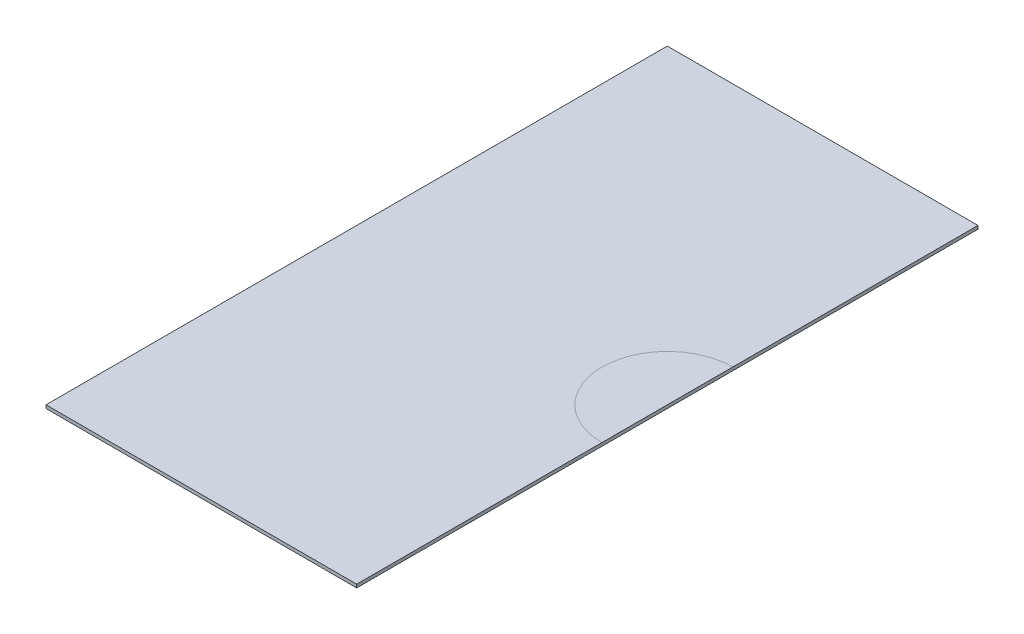
ISO-10303-21;
HEADER;
FILE_DESCRIPTION(('STEP AP214'),'2;1');
FILE_NAME('part.step','',(''),(''),'','','');
FILE_SCHEMA(('AUTOMOTIVE_DESIGN { 1 0 10303 214 1 1 1 1 }'));
ENDSEC;
DATA;
#1=APPLICATION_CONTEXT('core data for automotive mechanical design processes');
#2=APPLICATION_PROTOCOL_DEFINITION('international standard','automotive_design',2000,#1);
#3=PRODUCT_CONTEXT('',#1,'mechanical');
#4=PRODUCT('Part','Part','',(#3));
#5=PRODUCT_RELATED_PRODUCT_CATEGORY('part','',(#4));
#6=PRODUCT_DEFINITION_FORMATION('','',#4);
#7=PRODUCT_DEFINITION_CONTEXT('part definition',#1,'design');
#8=PRODUCT_DEFINITION('design','',#6,#7);
#9=PRODUCT_DEFINITION_SHAPE('','',#8);
#10=(LENGTH_UNIT() NAMED_UNIT(*) SI_UNIT(.MILLI.,.METRE.));
#11=(NAMED_UNIT(*) PLANE_ANGLE_UNIT() SI_UNIT($,.RADIAN.));
#12=(NAMED_UNIT(*) SI_UNIT($,.STERADIAN.) SOLID_ANGLE_UNIT());
#13=UNCERTAINTY_MEASURE_WITH_UNIT(LENGTH_MEASURE(1.E-05),#10,'distance_accuracy_value','');
#14=(GEOMETRIC_REPRESENTATION_CONTEXT(3) GLOBAL_UNCERTAINTY_ASSIGNED_CONTEXT((#13)) GLOBAL_UNIT_ASSIGNED_CONTEXT((#10,
#11,#12)) REPRESENTATION_CONTEXT('',''));
#15=CARTESIAN_POINT('',(0.,0.,0.));
#16=DIRECTION('',(0.,0.,1.));
#17=DIRECTION('',(1.,0.,0.));
#18=AXIS2_PLACEMENT_3D('',#15,#16,#17);
#19=CARTESIAN_POINT('',(0.,0.5,0.));
#20=DIRECTION('',(0.,-1.,0.));
#21=DIRECTION('',(0.,0.,-1.));
#22=AXIS2_PLACEMENT_3D('',#19,#20,#21);
#23=PLANE('',#22);
#24=CARTESIAN_POINT('',(47.499999996,0.5,0.));
#25=DIRECTION('',(0.,-1.,0.));
#26=DIRECTION('',(0.,0.,-1.));
#27=AXIS2_PLACEMENT_3D('',#24,#25,#26);
#28=CIRCLE('',#27,20.);
#29=CARTESIAN_POINT('',(47.499999996,0.5,-20.));
#30=VERTEX_POINT('',#29);
#31=CARTESIAN_POINT('',(47.499999996,0.5,20.));
#32=VERTEX_POINT('',#31);
#33=EDGE_CURVE('E11',#30,#32,#28,.F.);
#34=ORIENTED_EDGE('',*,*,#33,.F.);
#35=DIRECTION('',(0.,0.,-1.));
#36=VECTOR('',#35,1.);
#37=CARTESIAN_POINT('',(47.499999996,0.5,94.999999992));
#38=LINE('',#37,#36);
#39=CARTESIAN_POINT('',(47.499999996,0.5,-94.999999992));
#40=VERTEX_POINT('',#39);
#41=EDGE_CURVE('E82',#30,#40,#38,.T.);
#42=ORIENTED_EDGE('',*,*,#41,.T.);
#43=DIRECTION('',(-1.,0.,0.));
#44=VECTOR('',#43,1.);
#45=CARTESIAN_POINT('',(-47.499999996,0.5,-94.999999992));
#46=LINE('',#45,#44);
#47=CARTESIAN_POINT('',(-47.499999996,0.5,-94.999999992));
#48=VERTEX_POINT('',#47);
#49=EDGE_CURVE('E84',#40,#48,#46,.T.);
#50=ORIENTED_EDGE('',*,*,#49,.T.);
#51=DIRECTION('',(0.,0.,1.));
#52=VECTOR('',#51,1.);
#53=CARTESIAN_POINT('',(-47.499999996,0.5,94.999999992));
#54=LINE('',#53,#52);
#55=CARTESIAN_POINT('',(-47.499999996,0.5,94.999999992));
#56=VERTEX_POINT('',#55);
#57=EDGE_CURVE('E101',#48,#56,#54,.T.);
#58=ORIENTED_EDGE('',*,*,#57,.T.);
#59=DIRECTION('',(1.,0.,0.));
#60=VECTOR('',#59,1.);
#61=CARTESIAN_POINT('',(-47.499999996,0.5,94.999999992));
#62=LINE('',#61,#60);
#63=CARTESIAN_POINT('',(47.499999996,0.5,94.999999992));
#64=VERTEX_POINT('',#63);
#65=EDGE_CURVE('E117',#56,#64,#62,.T.);
#66=ORIENTED_EDGE('',*,*,#65,.T.);
#67=EDGE_CURVE('E92',#64,#32,#38,.T.);
#68=ORIENTED_EDGE('',*,*,#67,.T.);
#69=EDGE_LOOP('',(#34,#42,#50,#58,#66,#68));
#70=FACE_BOUND('',#69,.T.);
#71=ADVANCED_FACE('F40',(#70),#23,.F.);
#72=CARTESIAN_POINT('',(47.499999996,0.5,94.999999992));
#73=DIRECTION('',(-1.,0.,0.));
#74=DIRECTION('',(0.,0.,1.));
#75=AXIS2_PLACEMENT_3D('',#72,#73,#74);
#76=PLANE('',#75);
#77=DIRECTION('',(0.,0.,-1.));
#78=VECTOR('',#77,1.);
#79=CARTESIAN_POINT('',(47.499999996,-0.5,94.999999992));
#80=LINE('',#79,#78);
#81=CARTESIAN_POINT('',(47.499999996,-0.5,94.999999992));
#82=VERTEX_POINT('',#81);
#83=CARTESIAN_POINT('',(47.499999996,-0.5,-94.999999992));
#84=VERTEX_POINT('',#83);
#85=EDGE_CURVE('E105',#82,#84,#80,.T.);
#86=ORIENTED_EDGE('',*,*,#85,.T.);
#87=DIRECTION('',(0.,-1.,0.));
#88=VECTOR('',#87,1.);
#89=CARTESIAN_POINT('',(47.499999996,0.5,-94.999999992));
#90=LINE('',#89,#88);
#91=EDGE_CURVE('E49',#40,#84,#90,.T.);
#92=ORIENTED_EDGE('',*,*,#91,.F.);
#93=ORIENTED_EDGE('',*,*,#41,.F.);
#94=EDGE_CURVE('E89',#32,#30,#38,.T.);
#95=ORIENTED_EDGE('',*,*,#94,.F.);
#96=ORIENTED_EDGE('',*,*,#67,.F.);
#97=DIRECTION('',(0.,-1.,0.));
#98=VECTOR('',#97,1.);
#99=CARTESIAN_POINT('',(47.499999996,0.5,94.999999992));
#100=LINE('',#99,#98);
#101=EDGE_CURVE('E114',#64,#82,#100,.T.);
#102=ORIENTED_EDGE('',*,*,#101,.T.);
#103=EDGE_LOOP('',(#86,#92,#93,#95,#96,#102));
#104=FACE_BOUND('',#103,.T.);
#105=ADVANCED_FACE('F42',(#104),#76,.F.);
#106=CARTESIAN_POINT('',(-47.499999996,0.5,-94.999999992));
#107=DIRECTION('',(0.,0.,1.));
#108=DIRECTION('',(1.,0.,0.));
#109=AXIS2_PLACEMENT_3D('',#106,#107,#108);
#110=PLANE('',#109);
#111=DIRECTION('',(-1.,0.,0.));
#112=VECTOR('',#111,1.);
#113=CARTESIAN_POINT('',(-47.499999996,-0.5,-94.999999992));
#114=LINE('',#113,#112);
#115=CARTESIAN_POINT('',(-47.499999996,-0.5,-94.999999992));
#116=VERTEX_POINT('',#115);
#117=EDGE_CURVE('E123',#84,#116,#114,.T.);
#118=ORIENTED_EDGE('',*,*,#117,.T.);
#119=DIRECTION('',(0.,-1.,0.));
#120=VECTOR('',#119,1.);
#121=CARTESIAN_POINT('',(-47.499999996,0.5,-94.999999992));
#122=LINE('',#121,#120);
#123=EDGE_CURVE('E98',#48,#116,#122,.T.);
#124=ORIENTED_EDGE('',*,*,#123,.F.);
#125=ORIENTED_EDGE('',*,*,#49,.F.);
#126=ORIENTED_EDGE('',*,*,#91,.T.);
#127=EDGE_LOOP('',(#118,#124,#125,#126));
#128=FACE_BOUND('',#127,.T.);
#129=ADVANCED_FACE('F95',(#128),#110,.F.);
#130=CARTESIAN_POINT('',(-47.499999996,0.5,94.999999992));
#131=DIRECTION('',(1.,0.,0.));
#132=DIRECTION('',(0.,0.,-1.));
#133=AXIS2_PLACEMENT_3D('',#130,#131,#132);
#134=PLANE('',#133);
#135=DIRECTION('',(0.,0.,1.));
#136=VECTOR('',#135,1.);
#137=CARTESIAN_POINT('',(-47.499999996,-0.5,94.999999992));
#138=LINE('',#137,#136);
#139=CARTESIAN_POINT('',(-47.499999996,-0.5,94.999999992));
#140=VERTEX_POINT('',#139);
#141=EDGE_CURVE('E120',#116,#140,#138,.T.);
#142=ORIENTED_EDGE('',*,*,#141,.T.);
#143=DIRECTION('',(0.,-1.,0.));
#144=VECTOR('',#143,1.);
#145=CARTESIAN_POINT('',(-47.499999996,0.5,94.999999992));
#146=LINE('',#145,#144);
#147=EDGE_CURVE('E108',#56,#140,#146,.T.);
#148=ORIENTED_EDGE('',*,*,#147,.F.);
#149=ORIENTED_EDGE('',*,*,#57,.F.);
#150=ORIENTED_EDGE('',*,*,#123,.T.);
#151=EDGE_LOOP('',(#142,#148,#149,#150));
#152=FACE_BOUND('',#151,.T.);
#153=ADVANCED_FACE('F143',(#152),#134,.F.);
#154=CARTESIAN_POINT('',(-47.499999996,0.5,94.999999992));
#155=DIRECTION('',(0.,0.,-1.));
#156=DIRECTION('',(-1.,0.,0.));
#157=AXIS2_PLACEMENT_3D('',#154,#155,#156);
#158=PLANE('',#157);
#159=DIRECTION('',(1.,0.,0.));
#160=VECTOR('',#159,1.);
#161=CARTESIAN_POINT('',(-47.499999996,-0.5,94.999999992));
#162=LINE('',#161,#160);
#163=EDGE_CURVE('E90',#140,#82,#162,.T.);
#164=ORIENTED_EDGE('',*,*,#163,.T.);
#165=ORIENTED_EDGE('',*,*,#101,.F.);
#166=ORIENTED_EDGE('',*,*,#65,.F.);
#167=ORIENTED_EDGE('',*,*,#147,.T.);
#168=EDGE_LOOP('',(#164,#165,#166,#167));
#169=FACE_BOUND('',#168,.T.);
#170=ADVANCED_FACE('F145',(#169),#158,.F.);
#171=ORIENTED_EDGE('',*,*,#94,.T.);
#172=ORIENTED_EDGE('',*,*,#33,.T.);
#173=EDGE_LOOP('',(#171,#172));
#174=FACE_BOUND('',#173,.T.);
#175=ADVANCED_FACE('F134',(#174),#23,.F.);
#176=CARTESIAN_POINT('',(0.,-0.5,0.));
#177=DIRECTION('',(0.,-1.,0.));
#178=DIRECTION('',(0.,0.,-1.));
#179=AXIS2_PLACEMENT_3D('',#176,#177,#178);
#180=PLANE('',#179);
#181=ORIENTED_EDGE('',*,*,#85,.F.);
#182=ORIENTED_EDGE('',*,*,#163,.F.);
#183=ORIENTED_EDGE('',*,*,#141,.F.);
#184=ORIENTED_EDGE('',*,*,#117,.F.);
#185=EDGE_LOOP('',(#181,#182,#183,#184));
#186=FACE_BOUND('',#185,.T.);
#187=ADVANCED_FACE('F140',(#186),#180,.T.);
#188=CLOSED_SHELL('',(#71,#105,#129,#153,#170,#175,#187));
#189=MANIFOLD_SOLID_BREP('B2',#188);
#190=ADVANCED_BREP_SHAPE_REPRESENTATION('',(#18,#189),#14);
#191=SHAPE_DEFINITION_REPRESENTATION(#9,#190);
ENDSEC;
END-ISO-10303-21;
